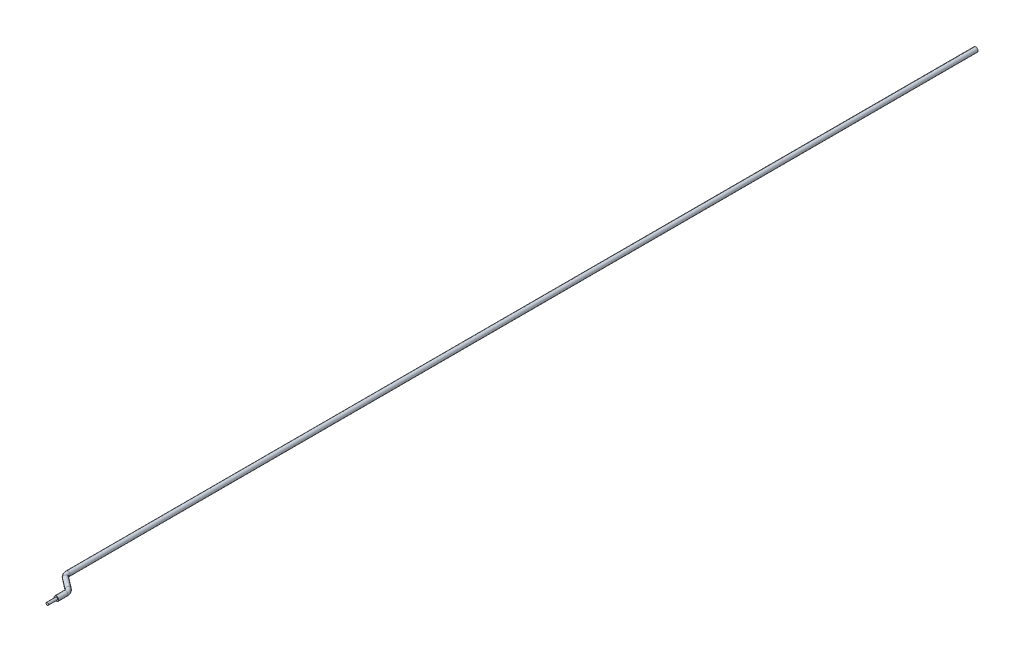
ISO-10303-21;
HEADER;
FILE_DESCRIPTION(('STEP AP214'),'2;1');
FILE_NAME('part.step','',(''),(''),'','','');
FILE_SCHEMA(('AUTOMOTIVE_DESIGN { 1 0 10303 214 1 1 1 1 }'));
ENDSEC;
DATA;
#1=APPLICATION_CONTEXT('core data for automotive mechanical design processes');
#2=APPLICATION_PROTOCOL_DEFINITION('international standard','automotive_design',2000,#1);
#3=PRODUCT_CONTEXT('',#1,'mechanical');
#4=PRODUCT('Part','Part','',(#3));
#5=PRODUCT_RELATED_PRODUCT_CATEGORY('part','',(#4));
#6=PRODUCT_DEFINITION_FORMATION('','',#4);
#7=PRODUCT_DEFINITION_CONTEXT('part definition',#1,'design');
#8=PRODUCT_DEFINITION('design','',#6,#7);
#9=PRODUCT_DEFINITION_SHAPE('','',#8);
#10=(LENGTH_UNIT() NAMED_UNIT(*) SI_UNIT(.MILLI.,.METRE.));
#11=(NAMED_UNIT(*) PLANE_ANGLE_UNIT() SI_UNIT($,.RADIAN.));
#12=(NAMED_UNIT(*) SI_UNIT($,.STERADIAN.) SOLID_ANGLE_UNIT());
#13=UNCERTAINTY_MEASURE_WITH_UNIT(LENGTH_MEASURE(1.E-05),#10,'distance_accuracy_value','');
#14=(GEOMETRIC_REPRESENTATION_CONTEXT(3) GLOBAL_UNCERTAINTY_ASSIGNED_CONTEXT((#13)) GLOBAL_UNIT_ASSIGNED_CONTEXT((#10,
#11,#12)) REPRESENTATION_CONTEXT('',''));
#15=CARTESIAN_POINT('',(0.,0.,0.));
#16=DIRECTION('',(0.,0.,1.));
#17=DIRECTION('',(1.,0.,0.));
#18=AXIS2_PLACEMENT_3D('',#15,#16,#17);
#19=CARTESIAN_POINT('',(0.,0.,3.));
#20=DIRECTION('',(0.,0.,1.));
#21=DIRECTION('',(1.,0.,0.));
#22=AXIS2_PLACEMENT_3D('',#19,#20,#21);
#23=PLANE('',#22);
#24=CARTESIAN_POINT('',(0.,0.,3.));
#25=DIRECTION('',(0.,0.,-1.));
#26=DIRECTION('',(-1.,0.,0.));
#27=AXIS2_PLACEMENT_3D('',#24,#25,#26);
#28=CIRCLE('',#27,0.4);
#29=CARTESIAN_POINT('',(-0.4,0.,3.));
#30=VERTEX_POINT('',#29);
#31=EDGE_CURVE('E18',#30,#30,#28,.T.);
#32=ORIENTED_EDGE('',*,*,#31,.F.);
#33=EDGE_LOOP('',(#32));
#34=FACE_BOUND('',#33,.T.);
#35=ADVANCED_FACE('F15',(#34),#23,.T.);
#36=CARTESIAN_POINT('',(0.,0.,3.));
#37=DIRECTION('',(0.,0.,-1.));
#38=DIRECTION('',(-1.,0.,0.));
#39=AXIS2_PLACEMENT_3D('',#36,#37,#38);
#40=CYLINDRICAL_SURFACE('',#39,0.4);
#41=CARTESIAN_POINT('',(0.,0.,0.));
#42=DIRECTION('',(0.,0.,-1.));
#43=DIRECTION('',(-1.,0.,0.));
#44=AXIS2_PLACEMENT_3D('',#41,#42,#43);
#45=CIRCLE('',#44,0.4);
#46=CARTESIAN_POINT('',(-0.4,0.,0.));
#47=VERTEX_POINT('',#46);
#48=EDGE_CURVE('E35',#47,#47,#45,.T.);
#49=ORIENTED_EDGE('',*,*,#48,.F.);
#50=EDGE_LOOP('',(#49));
#51=FACE_BOUND('',#50,.T.);
#52=ORIENTED_EDGE('',*,*,#31,.T.);
#53=EDGE_LOOP('',(#52));
#54=FACE_BOUND('',#53,.T.);
#55=ADVANCED_FACE('F42',(#51,#54),#40,.T.);
#56=CARTESIAN_POINT('',(0.,0.,0.));
#57=DIRECTION('',(0.,0.,1.));
#58=DIRECTION('',(1.,0.,0.));
#59=AXIS2_PLACEMENT_3D('',#56,#57,#58);
#60=PLANE('',#59);
#61=ORIENTED_EDGE('',*,*,#48,.T.);
#62=EDGE_LOOP('',(#61));
#63=FACE_BOUND('',#62,.T.);
#64=CARTESIAN_POINT('',(0.,0.,0.));
#65=DIRECTION('',(0.,0.,1.));
#66=DIRECTION('',(1.,0.,0.));
#67=AXIS2_PLACEMENT_3D('',#64,#65,#66);
#68=CIRCLE('',#67,0.75);
#69=CARTESIAN_POINT('',(0.75,0.,0.));
#70=VERTEX_POINT('',#69);
#71=EDGE_CURVE('E33',#70,#70,#68,.F.);
#72=ORIENTED_EDGE('',*,*,#71,.F.);
#73=EDGE_LOOP('',(#72));
#74=FACE_BOUND('',#73,.T.);
#75=ADVANCED_FACE('F49',(#63,#74),#60,.T.);
#76=CARTESIAN_POINT('',(0.,0.,-3.01519700509897));
#77=DIRECTION('',(0.,0.,1.));
#78=DIRECTION('',(1.,0.,0.));
#79=AXIS2_PLACEMENT_3D('',#76,#77,#78);
#80=CYLINDRICAL_SURFACE('',#79,0.75);
#81=ORIENTED_EDGE('',*,*,#71,.T.);
#82=EDGE_LOOP('',(#81));
#83=FACE_BOUND('',#82,.T.);
#84=CARTESIAN_POINT('',(0.,0.,-3.01519700509897));
#85=DIRECTION('',(0.,0.,-1.));
#86=DIRECTION('',(1.,0.,0.));
#87=AXIS2_PLACEMENT_3D('',#84,#85,#86);
#88=CIRCLE('',#87,0.75);
#89=CARTESIAN_POINT('',(0.75,0.,-3.01519700509897));
#90=VERTEX_POINT('',#89);
#91=EDGE_CURVE('E31',#90,#90,#88,.T.);
#92=ORIENTED_EDGE('',*,*,#91,.F.);
#93=EDGE_LOOP('',(#92));
#94=FACE_BOUND('',#93,.T.);
#95=ADVANCED_FACE('F79',(#83,#94),#80,.T.);
#96=CARTESIAN_POINT('',(-2.,0.,-3.01519700509897));
#97=DIRECTION('',(0.,1.,0.));
#98=DIRECTION('',(0.,0.,1.));
#99=AXIS2_PLACEMENT_3D('',#96,#97,#98);
#100=TOROIDAL_SURFACE('',#99,2.,0.75);
#101=CARTESIAN_POINT('',(-0.780578478300615,0.,-4.60044498330817));
#102=DIRECTION('',(-0.7926239891046,0.,-0.609710760849693));
#103=DIRECTION('',(-0.609710760849693,0.,0.7926239891046));
#104=AXIS2_PLACEMENT_3D('',#101,#102,#103);
#105=CIRCLE('',#104,0.75);
#106=CARTESIAN_POINT('',(-1.23786154893788,0.,-4.00597699147972));
#107=VERTEX_POINT('',#106);
#108=EDGE_CURVE('E73',#107,#107,#105,.T.);
#109=ORIENTED_EDGE('',*,*,#108,.F.);
#110=EDGE_LOOP('',(#109));
#111=FACE_BOUND('',#110,.T.);
#112=ORIENTED_EDGE('',*,*,#91,.T.);
#113=EDGE_LOOP('',(#112));
#114=FACE_BOUND('',#113,.T.);
#115=ADVANCED_FACE('F76',(#111,#114),#100,.T.);
#116=CARTESIAN_POINT('',(-0.780578478300615,0.,-4.60044498330817));
#117=DIRECTION('',(-0.7926239891046,0.,-0.609710760849693));
#118=DIRECTION('',(-0.609710760849693,0.,0.7926239891046));
#119=AXIS2_PLACEMENT_3D('',#116,#117,#118);
#120=CYLINDRICAL_SURFACE('',#119,0.75);
#121=CARTESIAN_POINT('',(-4.41942152169938,0.,-7.39955501669183));
#122=DIRECTION('',(-0.792623989104601,0.,-0.609710760849692));
#123=DIRECTION('',(-0.609710760849692,0.,0.792623989104601));
#124=AXIS2_PLACEMENT_3D('',#121,#122,#123);
#125=CIRCLE('',#124,0.75);
#126=CARTESIAN_POINT('',(-4.87670459233665,0.,-6.80508702486338));
#127=VERTEX_POINT('',#126);
#128=EDGE_CURVE('E27',#127,#127,#125,.T.);
#129=ORIENTED_EDGE('',*,*,#128,.F.);
#130=EDGE_LOOP('',(#129));
#131=FACE_BOUND('',#130,.T.);
#132=ORIENTED_EDGE('',*,*,#108,.T.);
#133=EDGE_LOOP('',(#132));
#134=FACE_BOUND('',#133,.T.);
#135=ADVANCED_FACE('F66',(#131,#134),#120,.T.);
#136=CARTESIAN_POINT('',(-3.2,0.,-8.98480299490104));
#137=DIRECTION('',(0.,-1.,0.));
#138=DIRECTION('',(0.,0.,-1.));
#139=AXIS2_PLACEMENT_3D('',#136,#137,#138);
#140=TOROIDAL_SURFACE('',#139,2.,0.75);
#141=ORIENTED_EDGE('',*,*,#128,.T.);
#142=EDGE_LOOP('',(#141));
#143=FACE_BOUND('',#142,.T.);
#144=CARTESIAN_POINT('',(-5.2,0.,-8.98480299490104));
#145=DIRECTION('',(0.,0.,-1.));
#146=DIRECTION('',(-1.,0.,0.));
#147=AXIS2_PLACEMENT_3D('',#144,#145,#146);
#148=CIRCLE('',#147,0.75);
#149=CARTESIAN_POINT('',(-5.95,0.,-8.98480299490104));
#150=VERTEX_POINT('',#149);
#151=EDGE_CURVE('E22',#150,#150,#148,.T.);
#152=ORIENTED_EDGE('',*,*,#151,.F.);
#153=EDGE_LOOP('',(#152));
#154=FACE_BOUND('',#153,.T.);
#155=ADVANCED_FACE('F58',(#143,#154),#140,.T.);
#156=CARTESIAN_POINT('',(-5.2,0.,-305.784802994901));
#157=DIRECTION('',(0.,0.,1.));
#158=DIRECTION('',(1.,0.,0.));
#159=AXIS2_PLACEMENT_3D('',#156,#157,#158);
#160=PLANE('',#159);
#161=CARTESIAN_POINT('',(-5.2,0.,-305.784802994901));
#162=DIRECTION('',(0.,0.,-1.));
#163=DIRECTION('',(-1.,0.,0.));
#164=AXIS2_PLACEMENT_3D('',#161,#162,#163);
#165=CIRCLE('',#164,0.75);
#166=CARTESIAN_POINT('',(-5.95,0.,-305.784802994901));
#167=VERTEX_POINT('',#166);
#168=EDGE_CURVE('E10',#167,#167,#165,.F.);
#169=ORIENTED_EDGE('',*,*,#168,.F.);
#170=EDGE_LOOP('',(#169));
#171=FACE_BOUND('',#170,.T.);
#172=ADVANCED_FACE('F53',(#171),#160,.F.);
#173=CARTESIAN_POINT('',(-5.2,0.,-8.98480299490104));
#174=DIRECTION('',(0.,0.,-1.));
#175=DIRECTION('',(-1.,0.,0.));
#176=AXIS2_PLACEMENT_3D('',#173,#174,#175);
#177=CYLINDRICAL_SURFACE('',#176,0.75);
#178=ORIENTED_EDGE('',*,*,#168,.T.);
#179=EDGE_LOOP('',(#178));
#180=FACE_BOUND('',#179,.T.);
#181=ORIENTED_EDGE('',*,*,#151,.T.);
#182=EDGE_LOOP('',(#181));
#183=FACE_BOUND('',#182,.T.);
#184=ADVANCED_FACE('F51',(#180,#183),#177,.T.);
#185=CLOSED_SHELL('',(#35,#55,#75,#95,#115,#135,#155,#172,#184));
#186=MANIFOLD_SOLID_BREP('B1',#185);
#187=ADVANCED_BREP_SHAPE_REPRESENTATION('',(#18,#186),#14);
#188=SHAPE_DEFINITION_REPRESENTATION(#9,#187);
ENDSEC;
END-ISO-10303-21;
